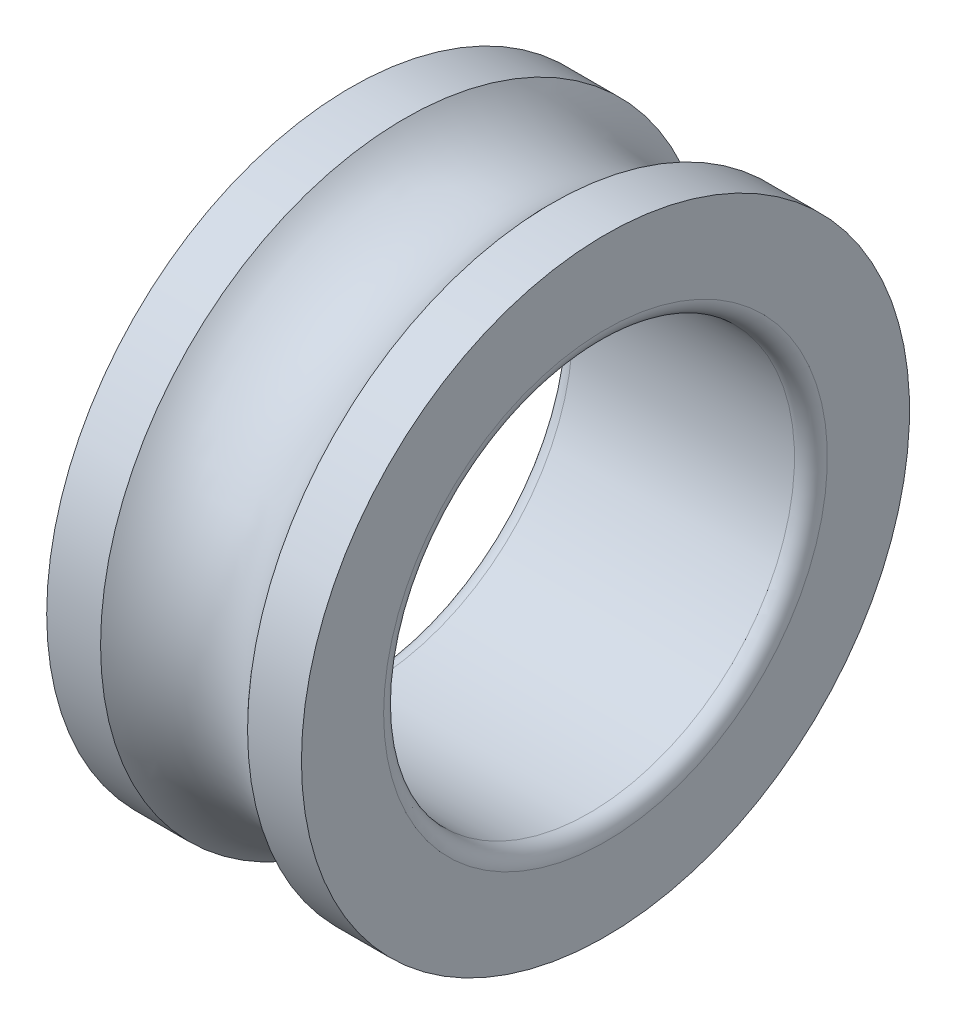
ISO-10303-21;
HEADER;
FILE_DESCRIPTION(('STEP AP214'),'2;1');
FILE_NAME('part.step','',(''),(''),'','','');
FILE_SCHEMA(('AUTOMOTIVE_DESIGN { 1 0 10303 214 1 1 1 1 }'));
ENDSEC;
DATA;
#1=APPLICATION_CONTEXT('core data for automotive mechanical design processes');
#2=APPLICATION_PROTOCOL_DEFINITION('international standard','automotive_design',2000,#1);
#3=PRODUCT_CONTEXT('',#1,'mechanical');
#4=PRODUCT('Part','Part','',(#3));
#5=PRODUCT_RELATED_PRODUCT_CATEGORY('part','',(#4));
#6=PRODUCT_DEFINITION_FORMATION('','',#4);
#7=PRODUCT_DEFINITION_CONTEXT('part definition',#1,'design');
#8=PRODUCT_DEFINITION('design','',#6,#7);
#9=PRODUCT_DEFINITION_SHAPE('','',#8);
#10=(LENGTH_UNIT() NAMED_UNIT(*) SI_UNIT(.MILLI.,.METRE.));
#11=(NAMED_UNIT(*) PLANE_ANGLE_UNIT() SI_UNIT($,.RADIAN.));
#12=(NAMED_UNIT(*) SI_UNIT($,.STERADIAN.) SOLID_ANGLE_UNIT());
#13=UNCERTAINTY_MEASURE_WITH_UNIT(LENGTH_MEASURE(1.E-05),#10,'distance_accuracy_value','');
#14=(GEOMETRIC_REPRESENTATION_CONTEXT(3) GLOBAL_UNCERTAINTY_ASSIGNED_CONTEXT((#13)) GLOBAL_UNIT_ASSIGNED_CONTEXT((#10,
#11,#12)) REPRESENTATION_CONTEXT('',''));
#15=CARTESIAN_POINT('',(0.,0.,0.));
#16=DIRECTION('',(0.,0.,1.));
#17=DIRECTION('',(1.,0.,0.));
#18=AXIS2_PLACEMENT_3D('',#15,#16,#17);
#19=CARTESIAN_POINT('',(15.5,37.,0.));
#20=DIRECTION('',(-1.,0.,0.));
#21=DIRECTION('',(0.,0.,1.));
#22=AXIS2_PLACEMENT_3D('',#19,#20,#21);
#23=PLANE('',#22);
#24=CARTESIAN_POINT('',(15.5,0.,0.));
#25=DIRECTION('',(-1.,0.,0.));
#26=DIRECTION('',(0.,0.,1.));
#27=AXIS2_PLACEMENT_3D('',#24,#25,#26);
#28=CIRCLE('',#27,27.);
#29=CARTESIAN_POINT('',(15.5,0.,27.));
#30=VERTEX_POINT('',#29);
#31=EDGE_CURVE('E10',#30,#30,#28,.T.);
#32=ORIENTED_EDGE('',*,*,#31,.T.);
#33=EDGE_LOOP('',(#32));
#34=FACE_BOUND('',#33,.T.);
#35=CARTESIAN_POINT('',(15.5,0.,0.));
#36=DIRECTION('',(-1.,0.,0.));
#37=DIRECTION('',(0.,0.,1.));
#38=AXIS2_PLACEMENT_3D('',#35,#36,#37);
#39=CIRCLE('',#38,37.);
#40=CARTESIAN_POINT('',(15.5,0.,37.));
#41=VERTEX_POINT('',#40);
#42=EDGE_CURVE('E52',#41,#41,#39,.T.);
#43=ORIENTED_EDGE('',*,*,#42,.F.);
#44=EDGE_LOOP('',(#43));
#45=FACE_BOUND('',#44,.T.);
#46=ADVANCED_FACE('F32',(#34,#45),#23,.F.);
#47=CARTESIAN_POINT('',(0.,0.,0.));
#48=DIRECTION('',(-1.,0.,0.));
#49=DIRECTION('',(0.,0.,1.));
#50=AXIS2_PLACEMENT_3D('',#47,#48,#49);
#51=CYLINDRICAL_SURFACE('',#50,37.);
#52=CARTESIAN_POINT('',(8.94427190999915,0.,0.));
#53=DIRECTION('',(-1.,0.,0.));
#54=DIRECTION('',(0.,0.,1.));
#55=AXIS2_PLACEMENT_3D('',#52,#53,#54);
#56=CIRCLE('',#55,37.);
#57=CARTESIAN_POINT('',(8.94427190999915,0.,37.));
#58=VERTEX_POINT('',#57);
#59=EDGE_CURVE('E55',#58,#58,#56,.T.);
#60=ORIENTED_EDGE('',*,*,#59,.F.);
#61=EDGE_LOOP('',(#60));
#62=FACE_BOUND('',#61,.T.);
#63=ORIENTED_EDGE('',*,*,#42,.T.);
#64=EDGE_LOOP('',(#63));
#65=FACE_BOUND('',#64,.T.);
#66=ADVANCED_FACE('F76',(#62,#65),#51,.T.);
#67=CARTESIAN_POINT('',(0.,0.,0.));
#68=DIRECTION('',(-1.,0.,0.));
#69=DIRECTION('',(0.,0.,1.));
#70=AXIS2_PLACEMENT_3D('',#67,#68,#69);
#71=TOROIDAL_SURFACE('',#70,45.,12.);
#72=CARTESIAN_POINT('',(-8.94427190999916,0.,0.));
#73=DIRECTION('',(-1.,0.,0.));
#74=DIRECTION('',(0.,0.,1.));
#75=AXIS2_PLACEMENT_3D('',#72,#73,#74);
#76=CIRCLE('',#75,37.);
#77=CARTESIAN_POINT('',(-8.94427190999916,0.,37.));
#78=VERTEX_POINT('',#77);
#79=EDGE_CURVE('E58',#78,#78,#76,.T.);
#80=ORIENTED_EDGE('',*,*,#79,.F.);
#81=EDGE_LOOP('',(#80));
#82=FACE_BOUND('',#81,.T.);
#83=ORIENTED_EDGE('',*,*,#59,.T.);
#84=EDGE_LOOP('',(#83));
#85=FACE_BOUND('',#84,.T.);
#86=ADVANCED_FACE('F70',(#82,#85),#71,.F.);
#87=CARTESIAN_POINT('',(0.,0.,0.));
#88=DIRECTION('',(-1.,0.,0.));
#89=DIRECTION('',(0.,0.,1.));
#90=AXIS2_PLACEMENT_3D('',#87,#88,#89);
#91=CYLINDRICAL_SURFACE('',#90,37.);
#92=CARTESIAN_POINT('',(-15.5,0.,0.));
#93=DIRECTION('',(-1.,0.,0.));
#94=DIRECTION('',(0.,0.,1.));
#95=AXIS2_PLACEMENT_3D('',#92,#93,#94);
#96=CIRCLE('',#95,37.);
#97=CARTESIAN_POINT('',(-15.5,0.,37.));
#98=VERTEX_POINT('',#97);
#99=EDGE_CURVE('E61',#98,#98,#96,.T.);
#100=ORIENTED_EDGE('',*,*,#99,.F.);
#101=EDGE_LOOP('',(#100));
#102=FACE_BOUND('',#101,.T.);
#103=ORIENTED_EDGE('',*,*,#79,.T.);
#104=EDGE_LOOP('',(#103));
#105=FACE_BOUND('',#104,.T.);
#106=ADVANCED_FACE('F67',(#102,#105),#91,.T.);
#107=CARTESIAN_POINT('',(-15.5,37.,0.));
#108=DIRECTION('',(1.,0.,0.));
#109=DIRECTION('',(0.,0.,-1.));
#110=AXIS2_PLACEMENT_3D('',#107,#108,#109);
#111=PLANE('',#110);
#112=CARTESIAN_POINT('',(-15.5,0.,0.));
#113=DIRECTION('',(1.,0.,0.));
#114=DIRECTION('',(0.,0.,-1.));
#115=AXIS2_PLACEMENT_3D('',#112,#113,#114);
#116=CIRCLE('',#115,27.);
#117=CARTESIAN_POINT('',(-15.5,0.,-27.));
#118=VERTEX_POINT('',#117);
#119=EDGE_CURVE('E39',#118,#118,#116,.T.);
#120=ORIENTED_EDGE('',*,*,#119,.T.);
#121=EDGE_LOOP('',(#120));
#122=FACE_BOUND('',#121,.T.);
#123=ORIENTED_EDGE('',*,*,#99,.T.);
#124=EDGE_LOOP('',(#123));
#125=FACE_BOUND('',#124,.T.);
#126=ADVANCED_FACE('F65',(#122,#125),#111,.F.);
#127=CARTESIAN_POINT('',(0.,0.,0.));
#128=DIRECTION('',(-1.,0.,0.));
#129=DIRECTION('',(0.,0.,1.));
#130=AXIS2_PLACEMENT_3D('',#127,#128,#129);
#131=CYLINDRICAL_SURFACE('',#130,25.);
#132=CARTESIAN_POINT('',(-13.5,0.,0.));
#133=DIRECTION('',(1.,0.,0.));
#134=DIRECTION('',(0.,0.,-1.));
#135=AXIS2_PLACEMENT_3D('',#132,#133,#134);
#136=CIRCLE('',#135,25.);
#137=CARTESIAN_POINT('',(-13.5,0.,-25.));
#138=VERTEX_POINT('',#137);
#139=EDGE_CURVE('E43',#138,#138,#136,.F.);
#140=ORIENTED_EDGE('',*,*,#139,.T.);
#141=EDGE_LOOP('',(#140));
#142=FACE_BOUND('',#141,.T.);
#143=CARTESIAN_POINT('',(13.5,0.,0.));
#144=DIRECTION('',(-1.,0.,0.));
#145=DIRECTION('',(0.,0.,1.));
#146=AXIS2_PLACEMENT_3D('',#143,#144,#145);
#147=CIRCLE('',#146,25.);
#148=CARTESIAN_POINT('',(13.5,0.,25.));
#149=VERTEX_POINT('',#148);
#150=EDGE_CURVE('E47',#149,#149,#147,.F.);
#151=ORIENTED_EDGE('',*,*,#150,.T.);
#152=EDGE_LOOP('',(#151));
#153=FACE_BOUND('',#152,.T.);
#154=ADVANCED_FACE('F91',(#142,#153),#131,.F.);
#155=CARTESIAN_POINT('',(-13.5,0.,0.));
#156=DIRECTION('',(1.,0.,0.));
#157=DIRECTION('',(0.,0.,-1.));
#158=AXIS2_PLACEMENT_3D('',#155,#156,#157);
#159=TOROIDAL_SURFACE('',#158,27.,2.);
#160=ORIENTED_EDGE('',*,*,#119,.F.);
#161=EDGE_LOOP('',(#160));
#162=FACE_BOUND('',#161,.T.);
#163=ORIENTED_EDGE('',*,*,#139,.F.);
#164=EDGE_LOOP('',(#163));
#165=FACE_BOUND('',#164,.T.);
#166=ADVANCED_FACE('F89',(#162,#165),#159,.T.);
#167=CARTESIAN_POINT('',(13.5,0.,0.));
#168=DIRECTION('',(-1.,0.,0.));
#169=DIRECTION('',(0.,0.,1.));
#170=AXIS2_PLACEMENT_3D('',#167,#168,#169);
#171=TOROIDAL_SURFACE('',#170,27.,2.);
#172=ORIENTED_EDGE('',*,*,#150,.F.);
#173=EDGE_LOOP('',(#172));
#174=FACE_BOUND('',#173,.T.);
#175=ORIENTED_EDGE('',*,*,#31,.F.);
#176=EDGE_LOOP('',(#175));
#177=FACE_BOUND('',#176,.T.);
#178=ADVANCED_FACE('F34',(#174,#177),#171,.T.);
#179=CLOSED_SHELL('',(#46,#66,#86,#106,#126,#154,#166,#178));
#180=MANIFOLD_SOLID_BREP('B2',#179);
#181=ADVANCED_BREP_SHAPE_REPRESENTATION('',(#18,#180),#14);
#182=SHAPE_DEFINITION_REPRESENTATION(#9,#181);
ENDSEC;
END-ISO-10303-21;
